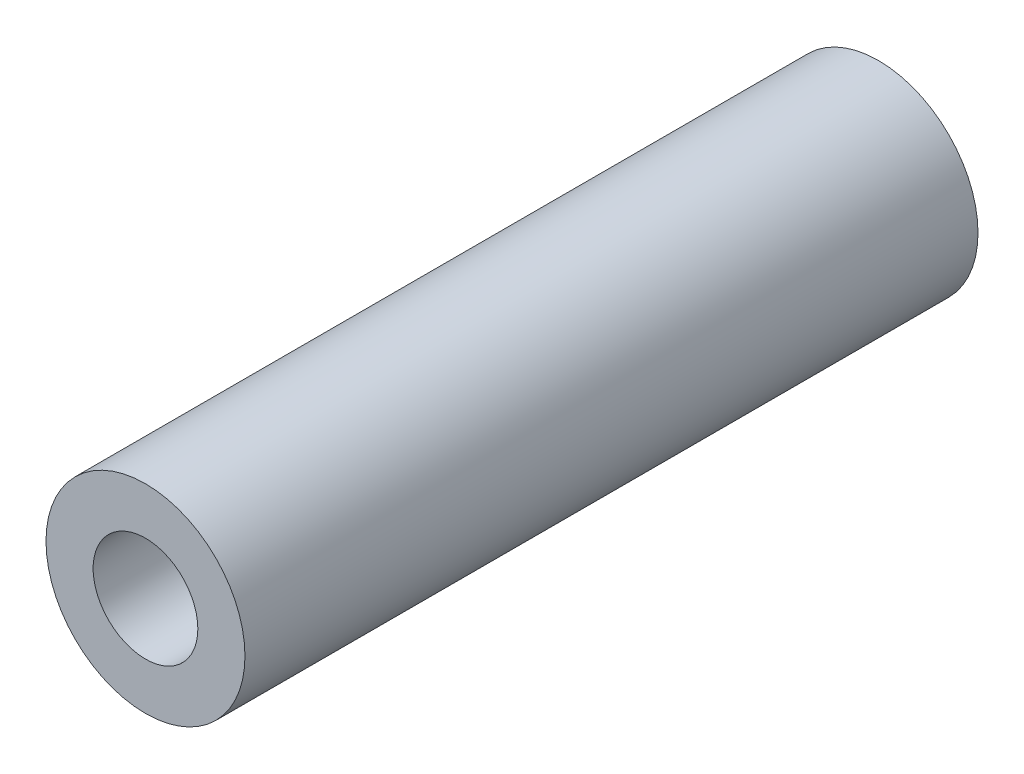
ISO-10303-21;
HEADER;
FILE_DESCRIPTION(('STEP AP214'),'2;1');
FILE_NAME('part.step','',(''),(''),'','','');
FILE_SCHEMA(('AUTOMOTIVE_DESIGN { 1 0 10303 214 1 1 1 1 }'));
ENDSEC;
DATA;
#1=APPLICATION_CONTEXT('core data for automotive mechanical design processes');
#2=APPLICATION_PROTOCOL_DEFINITION('international standard','automotive_design',2000,#1);
#3=PRODUCT_CONTEXT('',#1,'mechanical');
#4=PRODUCT('Part','Part','',(#3));
#5=PRODUCT_RELATED_PRODUCT_CATEGORY('part','',(#4));
#6=PRODUCT_DEFINITION_FORMATION('','',#4);
#7=PRODUCT_DEFINITION_CONTEXT('part definition',#1,'design');
#8=PRODUCT_DEFINITION('design','',#6,#7);
#9=PRODUCT_DEFINITION_SHAPE('','',#8);
#10=(LENGTH_UNIT() NAMED_UNIT(*) SI_UNIT(.MILLI.,.METRE.));
#11=(NAMED_UNIT(*) PLANE_ANGLE_UNIT() SI_UNIT($,.RADIAN.));
#12=(NAMED_UNIT(*) SI_UNIT($,.STERADIAN.) SOLID_ANGLE_UNIT());
#13=UNCERTAINTY_MEASURE_WITH_UNIT(LENGTH_MEASURE(1.E-05),#10,'distance_accuracy_value','');
#14=(GEOMETRIC_REPRESENTATION_CONTEXT(3) GLOBAL_UNCERTAINTY_ASSIGNED_CONTEXT((#13)) GLOBAL_UNIT_ASSIGNED_CONTEXT((#10,
#11,#12)) REPRESENTATION_CONTEXT('',''));
#15=CARTESIAN_POINT('',(0.,0.,0.));
#16=DIRECTION('',(0.,0.,1.));
#17=DIRECTION('',(1.,0.,0.));
#18=AXIS2_PLACEMENT_3D('',#15,#16,#17);
#19=CARTESIAN_POINT('',(0.,0.,17.5));
#20=DIRECTION('',(0.,0.,1.));
#21=DIRECTION('',(1.,0.,0.));
#22=AXIS2_PLACEMENT_3D('',#19,#20,#21);
#23=PLANE('',#22);
#24=CARTESIAN_POINT('',(0.,0.,17.5));
#25=DIRECTION('',(0.,0.,1.));
#26=DIRECTION('',(1.,0.,0.));
#27=AXIS2_PLACEMENT_3D('',#24,#25,#26);
#28=CIRCLE('',#27,4.75);
#29=CARTESIAN_POINT('',(4.75,0.,17.5));
#30=VERTEX_POINT('',#29);
#31=EDGE_CURVE('E10',#30,#30,#28,.T.);
#32=ORIENTED_EDGE('',*,*,#31,.T.);
#33=EDGE_LOOP('',(#32));
#34=FACE_BOUND('',#33,.T.);
#35=CARTESIAN_POINT('',(0.,0.,17.5));
#36=DIRECTION('',(0.,0.,1.));
#37=DIRECTION('',(1.,0.,0.));
#38=AXIS2_PLACEMENT_3D('',#35,#36,#37);
#39=CIRCLE('',#38,2.5);
#40=CARTESIAN_POINT('',(2.5,0.,17.5));
#41=VERTEX_POINT('',#40);
#42=EDGE_CURVE('E50',#41,#41,#39,.T.);
#43=ORIENTED_EDGE('',*,*,#42,.F.);
#44=EDGE_LOOP('',(#43));
#45=FACE_BOUND('',#44,.T.);
#46=ADVANCED_FACE('F37',(#34,#45),#23,.T.);
#47=CARTESIAN_POINT('',(0.,0.,-17.5));
#48=DIRECTION('',(0.,0.,1.));
#49=DIRECTION('',(1.,0.,0.));
#50=AXIS2_PLACEMENT_3D('',#47,#48,#49);
#51=PLANE('',#50);
#52=CARTESIAN_POINT('',(0.,0.,-17.5));
#53=DIRECTION('',(0.,0.,1.));
#54=DIRECTION('',(1.,0.,0.));
#55=AXIS2_PLACEMENT_3D('',#52,#53,#54);
#56=CIRCLE('',#55,4.75);
#57=CARTESIAN_POINT('',(4.75,0.,-17.5));
#58=VERTEX_POINT('',#57);
#59=EDGE_CURVE('E41',#58,#58,#56,.T.);
#60=ORIENTED_EDGE('',*,*,#59,.F.);
#61=EDGE_LOOP('',(#60));
#62=FACE_BOUND('',#61,.T.);
#63=CARTESIAN_POINT('',(0.,0.,-17.5));
#64=DIRECTION('',(0.,0.,1.));
#65=DIRECTION('',(1.,0.,0.));
#66=AXIS2_PLACEMENT_3D('',#63,#64,#65);
#67=CIRCLE('',#66,2.5);
#68=CARTESIAN_POINT('',(2.5,0.,-17.5));
#69=VERTEX_POINT('',#68);
#70=EDGE_CURVE('E52',#69,#69,#67,.T.);
#71=ORIENTED_EDGE('',*,*,#70,.T.);
#72=EDGE_LOOP('',(#71));
#73=FACE_BOUND('',#72,.T.);
#74=ADVANCED_FACE('F64',(#62,#73),#51,.F.);
#75=CARTESIAN_POINT('',(0.,0.,17.5));
#76=DIRECTION('',(0.,0.,-1.));
#77=DIRECTION('',(-1.,0.,0.));
#78=AXIS2_PLACEMENT_3D('',#75,#76,#77);
#79=CYLINDRICAL_SURFACE('',#78,4.75);
#80=ORIENTED_EDGE('',*,*,#31,.F.);
#81=EDGE_LOOP('',(#80));
#82=FACE_BOUND('',#81,.T.);
#83=ORIENTED_EDGE('',*,*,#59,.T.);
#84=EDGE_LOOP('',(#83));
#85=FACE_BOUND('',#84,.T.);
#86=ADVANCED_FACE('F39',(#82,#85),#79,.T.);
#87=CARTESIAN_POINT('',(0.,0.,17.5));
#88=DIRECTION('',(0.,0.,-1.));
#89=DIRECTION('',(-1.,0.,0.));
#90=AXIS2_PLACEMENT_3D('',#87,#88,#89);
#91=CYLINDRICAL_SURFACE('',#90,2.5);
#92=ORIENTED_EDGE('',*,*,#42,.T.);
#93=EDGE_LOOP('',(#92));
#94=FACE_BOUND('',#93,.T.);
#95=ORIENTED_EDGE('',*,*,#70,.F.);
#96=EDGE_LOOP('',(#95));
#97=FACE_BOUND('',#96,.T.);
#98=ADVANCED_FACE('F60',(#94,#97),#91,.F.);
#99=CLOSED_SHELL('',(#46,#74,#86,#98));
#100=MANIFOLD_SOLID_BREP('B2',#99);
#101=ADVANCED_BREP_SHAPE_REPRESENTATION('',(#18,#100),#14);
#102=SHAPE_DEFINITION_REPRESENTATION(#9,#101);
ENDSEC;
END-ISO-10303-21;
